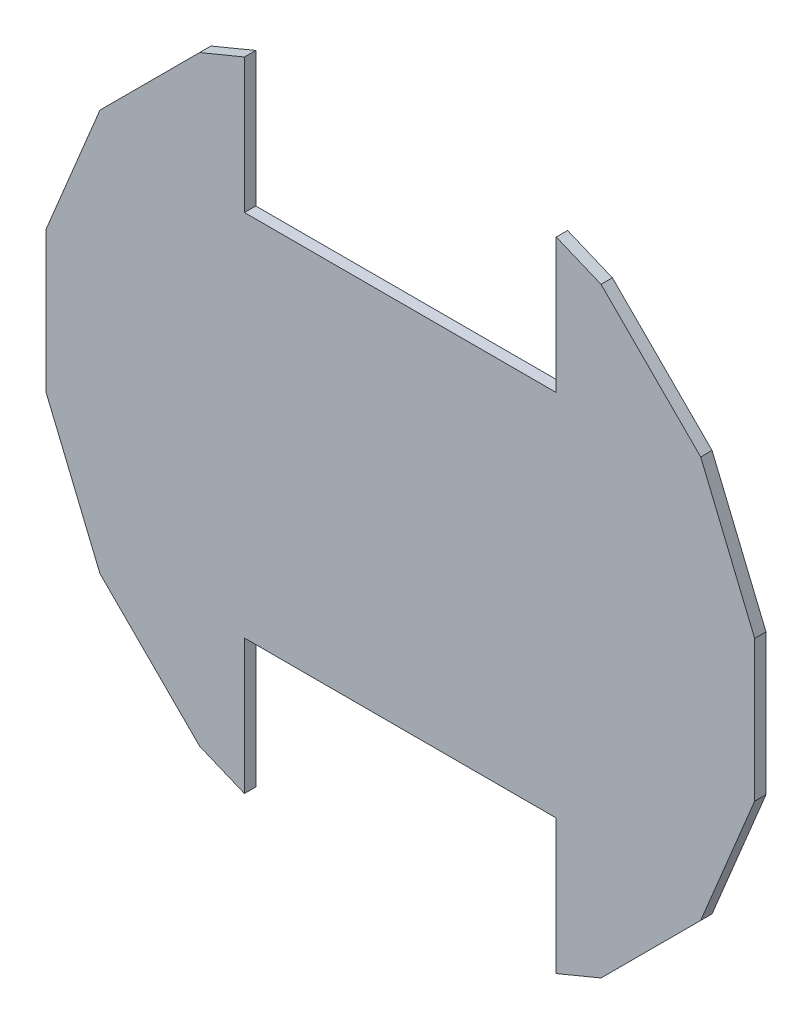
ISO-10303-21;
HEADER;
FILE_DESCRIPTION(('STEP AP214'),'2;1');
FILE_NAME('part.step','',(''),(''),'','','');
FILE_SCHEMA(('AUTOMOTIVE_DESIGN { 1 0 10303 214 1 1 1 1 }'));
ENDSEC;
DATA;
#1=APPLICATION_CONTEXT('core data for automotive mechanical design processes');
#2=APPLICATION_PROTOCOL_DEFINITION('international standard','automotive_design',2000,#1);
#3=PRODUCT_CONTEXT('',#1,'mechanical');
#4=PRODUCT('Part','Part','',(#3));
#5=PRODUCT_RELATED_PRODUCT_CATEGORY('part','',(#4));
#6=PRODUCT_DEFINITION_FORMATION('','',#4);
#7=PRODUCT_DEFINITION_CONTEXT('part definition',#1,'design');
#8=PRODUCT_DEFINITION('design','',#6,#7);
#9=PRODUCT_DEFINITION_SHAPE('','',#8);
#10=(LENGTH_UNIT() NAMED_UNIT(*) SI_UNIT(.MILLI.,.METRE.));
#11=(NAMED_UNIT(*) PLANE_ANGLE_UNIT() SI_UNIT($,.RADIAN.));
#12=(NAMED_UNIT(*) SI_UNIT($,.STERADIAN.) SOLID_ANGLE_UNIT());
#13=UNCERTAINTY_MEASURE_WITH_UNIT(LENGTH_MEASURE(1.E-05),#10,'distance_accuracy_value','');
#14=(GEOMETRIC_REPRESENTATION_CONTEXT(3) GLOBAL_UNCERTAINTY_ASSIGNED_CONTEXT((#13)) GLOBAL_UNIT_ASSIGNED_CONTEXT((#10,
#11,#12)) REPRESENTATION_CONTEXT('',''));
#15=CARTESIAN_POINT('',(0.,0.,0.));
#16=DIRECTION('',(0.,0.,1.));
#17=DIRECTION('',(1.,0.,0.));
#18=AXIS2_PLACEMENT_3D('',#15,#16,#17);
#19=CARTESIAN_POINT('',(0.,26.,1.6));
#20=DIRECTION('',(0.,1.,0.));
#21=DIRECTION('',(0.,0.,1.));
#22=AXIS2_PLACEMENT_3D('',#19,#20,#21);
#23=PLANE('',#22);
#24=DIRECTION('',(1.,0.,0.));
#25=VECTOR('',#24,1.);
#26=CARTESIAN_POINT('',(0.,26.,0.));
#27=LINE('',#26,#25);
#28=CARTESIAN_POINT('',(-22.,26.,0.));
#29=VERTEX_POINT('',#28);
#30=CARTESIAN_POINT('',(22.,26.,0.));
#31=VERTEX_POINT('',#30);
#32=EDGE_CURVE('E203',#29,#31,#27,.T.);
#33=ORIENTED_EDGE('',*,*,#32,.F.);
#34=DIRECTION('',(0.,0.,-1.));
#35=VECTOR('',#34,1.);
#36=CARTESIAN_POINT('',(-22.,26.,1.6));
#37=LINE('',#36,#35);
#38=CARTESIAN_POINT('',(-22.,26.,1.6));
#39=VERTEX_POINT('',#38);
#40=EDGE_CURVE('E11',#39,#29,#37,.T.);
#41=ORIENTED_EDGE('',*,*,#40,.F.);
#42=DIRECTION('',(1.,0.,0.));
#43=VECTOR('',#42,1.);
#44=CARTESIAN_POINT('',(0.,26.,1.6));
#45=LINE('',#44,#43);
#46=CARTESIAN_POINT('',(22.,26.,1.6));
#47=VERTEX_POINT('',#46);
#48=EDGE_CURVE('E245',#39,#47,#45,.T.);
#49=ORIENTED_EDGE('',*,*,#48,.T.);
#50=DIRECTION('',(0.,0.,-1.));
#51=VECTOR('',#50,1.);
#52=CARTESIAN_POINT('',(22.,26.,1.6));
#53=LINE('',#52,#51);
#54=EDGE_CURVE('E53',#47,#31,#53,.T.);
#55=ORIENTED_EDGE('',*,*,#54,.T.);
#56=EDGE_LOOP('',(#33,#41,#49,#55));
#57=FACE_BOUND('',#56,.T.);
#58=ADVANCED_FACE('F37',(#57),#23,.T.);
#59=CARTESIAN_POINT('',(-22.,0.,1.6));
#60=DIRECTION('',(-1.,0.,0.));
#61=DIRECTION('',(0.,-1.,0.));
#62=AXIS2_PLACEMENT_3D('',#59,#60,#61);
#63=PLANE('',#62);
#64=DIRECTION('',(0.,1.,0.));
#65=VECTOR('',#64,1.);
#66=CARTESIAN_POINT('',(-22.,0.,0.));
#67=LINE('',#66,#65);
#68=CARTESIAN_POINT('',(-22.,45.0069116424116,0.));
#69=VERTEX_POINT('',#68);
#70=EDGE_CURVE('E205',#29,#69,#67,.T.);
#71=ORIENTED_EDGE('',*,*,#70,.T.);
#72=DIRECTION('',(0.,0.,-1.));
#73=VECTOR('',#72,1.);
#74=CARTESIAN_POINT('',(-22.,45.0069116424116,1.6));
#75=LINE('',#74,#73);
#76=CARTESIAN_POINT('',(-22.,45.0069116424116,1.6));
#77=VERTEX_POINT('',#76);
#78=EDGE_CURVE('E45',#77,#69,#75,.T.);
#79=ORIENTED_EDGE('',*,*,#78,.F.);
#80=DIRECTION('',(0.,1.,0.));
#81=VECTOR('',#80,1.);
#82=CARTESIAN_POINT('',(-22.,0.,1.6));
#83=LINE('',#82,#81);
#84=EDGE_CURVE('E571',#39,#77,#83,.T.);
#85=ORIENTED_EDGE('',*,*,#84,.F.);
#86=ORIENTED_EDGE('',*,*,#40,.T.);
#87=EDGE_LOOP('',(#71,#79,#85,#86));
#88=FACE_BOUND('',#87,.T.);
#89=ADVANCED_FACE('F361',(#88),#63,.F.);
#90=CARTESIAN_POINT('',(-19.1341716182545,46.1939766255643,1.6));
#91=DIRECTION('',(0.38268343236509,-0.923879532511287,0.));
#92=DIRECTION('',(0.923879532511287,0.38268343236509,0.));
#93=AXIS2_PLACEMENT_3D('',#90,#91,#92);
#94=PLANE('',#93);
#95=DIRECTION('',(-0.923879532511287,-0.38268343236509,0.));
#96=VECTOR('',#95,1.);
#97=CARTESIAN_POINT('',(-19.1341716182545,46.1939766255643,0.));
#98=LINE('',#97,#96);
#99=CARTESIAN_POINT('',(-28.3227248675261,42.3879532511287,0.));
#100=VERTEX_POINT('',#99);
#101=EDGE_CURVE('E207',#69,#100,#98,.T.);
#102=ORIENTED_EDGE('',*,*,#101,.T.);
#103=DIRECTION('',(0.,0.,-1.));
#104=VECTOR('',#103,1.);
#105=CARTESIAN_POINT('',(-28.3227248675261,42.3879532511287,1.6));
#106=LINE('',#105,#104);
#107=CARTESIAN_POINT('',(-28.3227248675261,42.3879532511287,1.6));
#108=VERTEX_POINT('',#107);
#109=EDGE_CURVE('E286',#108,#100,#106,.T.);
#110=ORIENTED_EDGE('',*,*,#109,.F.);
#111=DIRECTION('',(-0.923879532511287,-0.38268343236509,0.));
#112=VECTOR('',#111,1.);
#113=CARTESIAN_POINT('',(-19.1341716182545,46.1939766255643,1.6));
#114=LINE('',#113,#112);
#115=EDGE_CURVE('E295',#77,#108,#114,.T.);
#116=ORIENTED_EDGE('',*,*,#115,.F.);
#117=ORIENTED_EDGE('',*,*,#78,.T.);
#118=EDGE_LOOP('',(#102,#110,#116,#117));
#119=FACE_BOUND('',#118,.T.);
#120=ADVANCED_FACE('F293',(#119),#94,.F.);
#121=CARTESIAN_POINT('',(-35.3553390593274,35.3553390593274,1.6));
#122=DIRECTION('',(0.707106781186548,-0.707106781186548,0.));
#123=DIRECTION('',(0.707106781186548,0.707106781186548,0.));
#124=AXIS2_PLACEMENT_3D('',#121,#122,#123);
#125=PLANE('',#124);
#126=DIRECTION('',(-0.707106781186548,-0.707106781186548,0.));
#127=VECTOR('',#126,1.);
#128=CARTESIAN_POINT('',(-35.3553390593274,35.3553390593274,0.));
#129=LINE('',#128,#127);
#130=CARTESIAN_POINT('',(-42.3879532511287,28.3227248675261,0.));
#131=VERTEX_POINT('',#130);
#132=EDGE_CURVE('E209',#100,#131,#129,.T.);
#133=ORIENTED_EDGE('',*,*,#132,.T.);
#134=DIRECTION('',(0.,0.,-1.));
#135=VECTOR('',#134,1.);
#136=CARTESIAN_POINT('',(-42.3879532511287,28.3227248675261,1.6));
#137=LINE('',#136,#135);
#138=CARTESIAN_POINT('',(-42.3879532511287,28.3227248675261,1.6));
#139=VERTEX_POINT('',#138);
#140=EDGE_CURVE('E283',#139,#131,#137,.T.);
#141=ORIENTED_EDGE('',*,*,#140,.F.);
#142=DIRECTION('',(-0.707106781186548,-0.707106781186548,0.));
#143=VECTOR('',#142,1.);
#144=CARTESIAN_POINT('',(-35.3553390593274,35.3553390593274,1.6));
#145=LINE('',#144,#143);
#146=EDGE_CURVE('E314',#108,#139,#145,.T.);
#147=ORIENTED_EDGE('',*,*,#146,.F.);
#148=ORIENTED_EDGE('',*,*,#109,.T.);
#149=EDGE_LOOP('',(#133,#141,#147,#148));
#150=FACE_BOUND('',#149,.T.);
#151=ADVANCED_FACE('F305',(#150),#125,.F.);
#152=CARTESIAN_POINT('',(-46.1939766255643,19.1341716182545,1.6));
#153=DIRECTION('',(0.923879532511287,-0.38268343236509,0.));
#154=DIRECTION('',(0.38268343236509,0.923879532511287,0.));
#155=AXIS2_PLACEMENT_3D('',#152,#153,#154);
#156=PLANE('',#155);
#157=DIRECTION('',(-0.38268343236509,-0.923879532511287,0.));
#158=VECTOR('',#157,1.);
#159=CARTESIAN_POINT('',(-46.1939766255643,19.1341716182545,0.));
#160=LINE('',#159,#158);
#161=CARTESIAN_POINT('',(-50.,9.9456183689829,0.));
#162=VERTEX_POINT('',#161);
#163=EDGE_CURVE('E211',#131,#162,#160,.T.);
#164=ORIENTED_EDGE('',*,*,#163,.T.);
#165=DIRECTION('',(0.,0.,-1.));
#166=VECTOR('',#165,1.);
#167=CARTESIAN_POINT('',(-50.,9.9456183689829,1.6));
#168=LINE('',#167,#166);
#169=CARTESIAN_POINT('',(-50.,9.9456183689829,1.6));
#170=VERTEX_POINT('',#169);
#171=EDGE_CURVE('E280',#170,#162,#168,.T.);
#172=ORIENTED_EDGE('',*,*,#171,.F.);
#173=DIRECTION('',(-0.38268343236509,-0.923879532511287,0.));
#174=VECTOR('',#173,1.);
#175=CARTESIAN_POINT('',(-46.1939766255643,19.1341716182545,1.6));
#176=LINE('',#175,#174);
#177=EDGE_CURVE('E311',#139,#170,#176,.T.);
#178=ORIENTED_EDGE('',*,*,#177,.F.);
#179=ORIENTED_EDGE('',*,*,#140,.T.);
#180=EDGE_LOOP('',(#164,#172,#178,#179));
#181=FACE_BOUND('',#180,.T.);
#182=ADVANCED_FACE('F309',(#181),#156,.F.);
#183=CARTESIAN_POINT('',(-50.,0.,1.6));
#184=DIRECTION('',(1.,0.,0.));
#185=DIRECTION('',(0.,0.,-1.));
#186=AXIS2_PLACEMENT_3D('',#183,#184,#185);
#187=PLANE('',#186);
#188=DIRECTION('',(0.,-1.,0.));
#189=VECTOR('',#188,1.);
#190=CARTESIAN_POINT('',(-50.,0.,0.));
#191=LINE('',#190,#189);
#192=CARTESIAN_POINT('',(-50.,-9.94561836898291,0.));
#193=VERTEX_POINT('',#192);
#194=EDGE_CURVE('E213',#162,#193,#191,.T.);
#195=ORIENTED_EDGE('',*,*,#194,.T.);
#196=DIRECTION('',(0.,0.,-1.));
#197=VECTOR('',#196,1.);
#198=CARTESIAN_POINT('',(-50.,-9.94561836898291,1.6));
#199=LINE('',#198,#197);
#200=CARTESIAN_POINT('',(-50.,-9.94561836898291,1.6));
#201=VERTEX_POINT('',#200);
#202=EDGE_CURVE('E277',#201,#193,#199,.T.);
#203=ORIENTED_EDGE('',*,*,#202,.F.);
#204=DIRECTION('',(0.,-1.,0.));
#205=VECTOR('',#204,1.);
#206=CARTESIAN_POINT('',(-50.,0.,1.6));
#207=LINE('',#206,#205);
#208=EDGE_CURVE('E313',#170,#201,#207,.T.);
#209=ORIENTED_EDGE('',*,*,#208,.F.);
#210=ORIENTED_EDGE('',*,*,#171,.T.);
#211=EDGE_LOOP('',(#195,#203,#209,#210));
#212=FACE_BOUND('',#211,.T.);
#213=ADVANCED_FACE('F374',(#212),#187,.F.);
#214=CARTESIAN_POINT('',(-46.1939766255643,-19.1341716182545,1.6));
#215=DIRECTION('',(0.923879532511287,0.38268343236509,0.));
#216=DIRECTION('',(-0.38268343236509,0.923879532511287,0.));
#217=AXIS2_PLACEMENT_3D('',#214,#215,#216);
#218=PLANE('',#217);
#219=DIRECTION('',(0.38268343236509,-0.923879532511287,0.));
#220=VECTOR('',#219,1.);
#221=CARTESIAN_POINT('',(-46.1939766255643,-19.1341716182545,0.));
#222=LINE('',#221,#220);
#223=CARTESIAN_POINT('',(-42.3879532511287,-28.3227248675261,0.));
#224=VERTEX_POINT('',#223);
#225=EDGE_CURVE('E215',#193,#224,#222,.T.);
#226=ORIENTED_EDGE('',*,*,#225,.T.);
#227=DIRECTION('',(0.,0.,-1.));
#228=VECTOR('',#227,1.);
#229=CARTESIAN_POINT('',(-42.3879532511287,-28.3227248675261,1.6));
#230=LINE('',#229,#228);
#231=CARTESIAN_POINT('',(-42.3879532511287,-28.3227248675261,1.6));
#232=VERTEX_POINT('',#231);
#233=EDGE_CURVE('E274',#232,#224,#230,.T.);
#234=ORIENTED_EDGE('',*,*,#233,.F.);
#235=DIRECTION('',(0.38268343236509,-0.923879532511287,0.));
#236=VECTOR('',#235,1.);
#237=CARTESIAN_POINT('',(-46.1939766255643,-19.1341716182545,1.6));
#238=LINE('',#237,#236);
#239=EDGE_CURVE('E316',#201,#232,#238,.T.);
#240=ORIENTED_EDGE('',*,*,#239,.F.);
#241=ORIENTED_EDGE('',*,*,#202,.T.);
#242=EDGE_LOOP('',(#226,#234,#240,#241));
#243=FACE_BOUND('',#242,.T.);
#244=ADVANCED_FACE('F377',(#243),#218,.F.);
#245=CARTESIAN_POINT('',(-35.3553390593274,-35.3553390593274,1.6));
#246=DIRECTION('',(0.707106781186548,0.707106781186548,0.));
#247=DIRECTION('',(-0.707106781186548,0.707106781186548,0.));
#248=AXIS2_PLACEMENT_3D('',#245,#246,#247);
#249=PLANE('',#248);
#250=DIRECTION('',(0.707106781186548,-0.707106781186548,0.));
#251=VECTOR('',#250,1.);
#252=CARTESIAN_POINT('',(-35.3553390593274,-35.3553390593274,0.));
#253=LINE('',#252,#251);
#254=CARTESIAN_POINT('',(-28.3227248675261,-42.3879532511286,0.));
#255=VERTEX_POINT('',#254);
#256=EDGE_CURVE('E217',#224,#255,#253,.T.);
#257=ORIENTED_EDGE('',*,*,#256,.T.);
#258=DIRECTION('',(0.,0.,-1.));
#259=VECTOR('',#258,1.);
#260=CARTESIAN_POINT('',(-28.3227248675261,-42.3879532511286,1.6));
#261=LINE('',#260,#259);
#262=CARTESIAN_POINT('',(-28.3227248675261,-42.3879532511286,1.6));
#263=VERTEX_POINT('',#262);
#264=EDGE_CURVE('E271',#263,#255,#261,.T.);
#265=ORIENTED_EDGE('',*,*,#264,.F.);
#266=DIRECTION('',(0.707106781186548,-0.707106781186548,0.));
#267=VECTOR('',#266,1.);
#268=CARTESIAN_POINT('',(-35.3553390593274,-35.3553390593274,1.6));
#269=LINE('',#268,#267);
#270=EDGE_CURVE('E322',#232,#263,#269,.T.);
#271=ORIENTED_EDGE('',*,*,#270,.F.);
#272=ORIENTED_EDGE('',*,*,#233,.T.);
#273=EDGE_LOOP('',(#257,#265,#271,#272));
#274=FACE_BOUND('',#273,.T.);
#275=ADVANCED_FACE('F381',(#274),#249,.F.);
#276=CARTESIAN_POINT('',(-19.1341716182545,-46.1939766255643,1.6));
#277=DIRECTION('',(0.38268343236509,0.923879532511287,0.));
#278=DIRECTION('',(-0.923879532511287,0.38268343236509,0.));
#279=AXIS2_PLACEMENT_3D('',#276,#277,#278);
#280=PLANE('',#279);
#281=DIRECTION('',(0.923879532511287,-0.38268343236509,0.));
#282=VECTOR('',#281,1.);
#283=CARTESIAN_POINT('',(-19.1341716182545,-46.1939766255643,0.));
#284=LINE('',#283,#282);
#285=CARTESIAN_POINT('',(-22.,-45.0069116424116,0.));
#286=VERTEX_POINT('',#285);
#287=EDGE_CURVE('E219',#255,#286,#284,.T.);
#288=ORIENTED_EDGE('',*,*,#287,.T.);
#289=DIRECTION('',(0.,0.,-1.));
#290=VECTOR('',#289,1.);
#291=CARTESIAN_POINT('',(-22.,-45.0069116424116,1.6));
#292=LINE('',#291,#290);
#293=CARTESIAN_POINT('',(-22.,-45.0069116424116,1.6));
#294=VERTEX_POINT('',#293);
#295=EDGE_CURVE('E269',#294,#286,#292,.T.);
#296=ORIENTED_EDGE('',*,*,#295,.F.);
#297=DIRECTION('',(0.923879532511287,-0.38268343236509,0.));
#298=VECTOR('',#297,1.);
#299=CARTESIAN_POINT('',(-19.1341716182545,-46.1939766255643,1.6));
#300=LINE('',#299,#298);
#301=EDGE_CURVE('E324',#263,#294,#300,.T.);
#302=ORIENTED_EDGE('',*,*,#301,.F.);
#303=ORIENTED_EDGE('',*,*,#264,.T.);
#304=EDGE_LOOP('',(#288,#296,#302,#303));
#305=FACE_BOUND('',#304,.T.);
#306=ADVANCED_FACE('F385',(#305),#280,.F.);
#307=CARTESIAN_POINT('',(-22.,0.,1.6));
#308=DIRECTION('',(1.,0.,0.));
#309=DIRECTION('',(0.,1.,0.));
#310=AXIS2_PLACEMENT_3D('',#307,#308,#309);
#311=PLANE('',#310);
#312=DIRECTION('',(0.,-1.,0.));
#313=VECTOR('',#312,1.);
#314=CARTESIAN_POINT('',(-22.,0.,0.));
#315=LINE('',#314,#313);
#316=CARTESIAN_POINT('',(-22.,-26.,0.));
#317=VERTEX_POINT('',#316);
#318=EDGE_CURVE('E222',#317,#286,#315,.T.);
#319=ORIENTED_EDGE('',*,*,#318,.F.);
#320=DIRECTION('',(0.,0.,-1.));
#321=VECTOR('',#320,1.);
#322=CARTESIAN_POINT('',(-22.,-26.,1.6));
#323=LINE('',#322,#321);
#324=CARTESIAN_POINT('',(-22.,-26.,1.6));
#325=VERTEX_POINT('',#324);
#326=EDGE_CURVE('E267',#325,#317,#323,.T.);
#327=ORIENTED_EDGE('',*,*,#326,.F.);
#328=DIRECTION('',(0.,-1.,0.));
#329=VECTOR('',#328,1.);
#330=CARTESIAN_POINT('',(-22.,0.,1.6));
#331=LINE('',#330,#329);
#332=EDGE_CURVE('E326',#325,#294,#331,.T.);
#333=ORIENTED_EDGE('',*,*,#332,.T.);
#334=ORIENTED_EDGE('',*,*,#295,.T.);
#335=EDGE_LOOP('',(#319,#327,#333,#334));
#336=FACE_BOUND('',#335,.T.);
#337=ADVANCED_FACE('F389',(#336),#311,.T.);
#338=CARTESIAN_POINT('',(0.,-26.,1.6));
#339=DIRECTION('',(0.,1.,0.));
#340=DIRECTION('',(0.,0.,1.));
#341=AXIS2_PLACEMENT_3D('',#338,#339,#340);
#342=PLANE('',#341);
#343=DIRECTION('',(1.,0.,0.));
#344=VECTOR('',#343,1.);
#345=CARTESIAN_POINT('',(0.,-26.,0.));
#346=LINE('',#345,#344);
#347=CARTESIAN_POINT('',(22.,-26.,0.));
#348=VERTEX_POINT('',#347);
#349=EDGE_CURVE('E225',#317,#348,#346,.T.);
#350=ORIENTED_EDGE('',*,*,#349,.T.);
#351=DIRECTION('',(0.,0.,-1.));
#352=VECTOR('',#351,1.);
#353=CARTESIAN_POINT('',(22.,-26.,1.6));
#354=LINE('',#353,#352);
#355=CARTESIAN_POINT('',(22.,-26.,1.6));
#356=VERTEX_POINT('',#355);
#357=EDGE_CURVE('E264',#356,#348,#354,.T.);
#358=ORIENTED_EDGE('',*,*,#357,.F.);
#359=DIRECTION('',(1.,0.,0.));
#360=VECTOR('',#359,1.);
#361=CARTESIAN_POINT('',(0.,-26.,1.6));
#362=LINE('',#361,#360);
#363=EDGE_CURVE('E329',#325,#356,#362,.T.);
#364=ORIENTED_EDGE('',*,*,#363,.F.);
#365=ORIENTED_EDGE('',*,*,#326,.T.);
#366=EDGE_LOOP('',(#350,#358,#364,#365));
#367=FACE_BOUND('',#366,.T.);
#368=ADVANCED_FACE('F393',(#367),#342,.F.);
#369=CARTESIAN_POINT('',(22.,0.,1.6));
#370=DIRECTION('',(1.,0.,0.));
#371=DIRECTION('',(0.,1.,0.));
#372=AXIS2_PLACEMENT_3D('',#369,#370,#371);
#373=PLANE('',#372);
#374=DIRECTION('',(0.,-1.,0.));
#375=VECTOR('',#374,1.);
#376=CARTESIAN_POINT('',(22.,0.,0.));
#377=LINE('',#376,#375);
#378=CARTESIAN_POINT('',(22.,-45.0069116424116,0.));
#379=VERTEX_POINT('',#378);
#380=EDGE_CURVE('E227',#348,#379,#377,.T.);
#381=ORIENTED_EDGE('',*,*,#380,.T.);
#382=DIRECTION('',(0.,0.,-1.));
#383=VECTOR('',#382,1.);
#384=CARTESIAN_POINT('',(22.,-45.0069116424116,1.6));
#385=LINE('',#384,#383);
#386=CARTESIAN_POINT('',(22.,-45.0069116424116,1.6));
#387=VERTEX_POINT('',#386);
#388=EDGE_CURVE('E261',#387,#379,#385,.T.);
#389=ORIENTED_EDGE('',*,*,#388,.F.);
#390=DIRECTION('',(0.,-1.,0.));
#391=VECTOR('',#390,1.);
#392=CARTESIAN_POINT('',(22.,0.,1.6));
#393=LINE('',#392,#391);
#394=EDGE_CURVE('E331',#356,#387,#393,.T.);
#395=ORIENTED_EDGE('',*,*,#394,.F.);
#396=ORIENTED_EDGE('',*,*,#357,.T.);
#397=EDGE_LOOP('',(#381,#389,#395,#396));
#398=FACE_BOUND('',#397,.T.);
#399=ADVANCED_FACE('F397',(#398),#373,.F.);
#400=CARTESIAN_POINT('',(19.1341716182545,-46.1939766255643,1.6));
#401=DIRECTION('',(-0.38268343236509,0.923879532511287,0.));
#402=DIRECTION('',(-0.923879532511287,-0.38268343236509,0.));
#403=AXIS2_PLACEMENT_3D('',#400,#401,#402);
#404=PLANE('',#403);
#405=DIRECTION('',(0.923879532511287,0.38268343236509,0.));
#406=VECTOR('',#405,1.);
#407=CARTESIAN_POINT('',(19.1341716182545,-46.1939766255643,0.));
#408=LINE('',#407,#406);
#409=CARTESIAN_POINT('',(28.3227248675261,-42.3879532511287,0.));
#410=VERTEX_POINT('',#409);
#411=EDGE_CURVE('E229',#379,#410,#408,.T.);
#412=ORIENTED_EDGE('',*,*,#411,.T.);
#413=DIRECTION('',(0.,0.,-1.));
#414=VECTOR('',#413,1.);
#415=CARTESIAN_POINT('',(28.3227248675261,-42.3879532511287,1.6));
#416=LINE('',#415,#414);
#417=CARTESIAN_POINT('',(28.3227248675261,-42.3879532511287,1.6));
#418=VERTEX_POINT('',#417);
#419=EDGE_CURVE('E258',#418,#410,#416,.T.);
#420=ORIENTED_EDGE('',*,*,#419,.F.);
#421=DIRECTION('',(0.923879532511287,0.38268343236509,0.));
#422=VECTOR('',#421,1.);
#423=CARTESIAN_POINT('',(19.1341716182545,-46.1939766255643,1.6));
#424=LINE('',#423,#422);
#425=EDGE_CURVE('E333',#387,#418,#424,.T.);
#426=ORIENTED_EDGE('',*,*,#425,.F.);
#427=ORIENTED_EDGE('',*,*,#388,.T.);
#428=EDGE_LOOP('',(#412,#420,#426,#427));
#429=FACE_BOUND('',#428,.T.);
#430=ADVANCED_FACE('F401',(#429),#404,.F.);
#431=CARTESIAN_POINT('',(35.3553390593274,-35.3553390593274,1.6));
#432=DIRECTION('',(-0.707106781186548,0.707106781186548,0.));
#433=DIRECTION('',(-0.707106781186548,-0.707106781186547,0.));
#434=AXIS2_PLACEMENT_3D('',#431,#432,#433);
#435=PLANE('',#434);
#436=DIRECTION('',(0.707106781186548,0.707106781186547,0.));
#437=VECTOR('',#436,1.);
#438=CARTESIAN_POINT('',(35.3553390593274,-35.3553390593274,0.));
#439=LINE('',#438,#437);
#440=CARTESIAN_POINT('',(42.3879532511286,-28.3227248675261,0.));
#441=VERTEX_POINT('',#440);
#442=EDGE_CURVE('E231',#410,#441,#439,.T.);
#443=ORIENTED_EDGE('',*,*,#442,.T.);
#444=DIRECTION('',(0.,0.,-1.));
#445=VECTOR('',#444,1.);
#446=CARTESIAN_POINT('',(42.3879532511286,-28.3227248675261,1.6));
#447=LINE('',#446,#445);
#448=CARTESIAN_POINT('',(42.3879532511286,-28.3227248675261,1.6));
#449=VERTEX_POINT('',#448);
#450=EDGE_CURVE('E255',#449,#441,#447,.T.);
#451=ORIENTED_EDGE('',*,*,#450,.F.);
#452=DIRECTION('',(0.707106781186548,0.707106781186547,0.));
#453=VECTOR('',#452,1.);
#454=CARTESIAN_POINT('',(35.3553390593274,-35.3553390593274,1.6));
#455=LINE('',#454,#453);
#456=EDGE_CURVE('E335',#418,#449,#455,.T.);
#457=ORIENTED_EDGE('',*,*,#456,.F.);
#458=ORIENTED_EDGE('',*,*,#419,.T.);
#459=EDGE_LOOP('',(#443,#451,#457,#458));
#460=FACE_BOUND('',#459,.T.);
#461=ADVANCED_FACE('F405',(#460),#435,.F.);
#462=CARTESIAN_POINT('',(46.1939766255643,-19.1341716182545,1.6));
#463=DIRECTION('',(-0.923879532511287,0.382683432365089,0.));
#464=DIRECTION('',(-0.382683432365089,-0.923879532511287,0.));
#465=AXIS2_PLACEMENT_3D('',#462,#463,#464);
#466=PLANE('',#465);
#467=DIRECTION('',(0.38268343236509,0.923879532511287,0.));
#468=VECTOR('',#467,1.);
#469=CARTESIAN_POINT('',(46.1939766255643,-19.1341716182545,0.));
#470=LINE('',#469,#468);
#471=CARTESIAN_POINT('',(50.,-9.9456183689829,0.));
#472=VERTEX_POINT('',#471);
#473=EDGE_CURVE('E233',#441,#472,#470,.T.);
#474=ORIENTED_EDGE('',*,*,#473,.T.);
#475=DIRECTION('',(0.,0.,-1.));
#476=VECTOR('',#475,1.);
#477=CARTESIAN_POINT('',(50.,-9.9456183689829,1.6));
#478=LINE('',#477,#476);
#479=CARTESIAN_POINT('',(50.,-9.9456183689829,1.6));
#480=VERTEX_POINT('',#479);
#481=EDGE_CURVE('E252',#480,#472,#478,.T.);
#482=ORIENTED_EDGE('',*,*,#481,.F.);
#483=DIRECTION('',(0.38268343236509,0.923879532511287,0.));
#484=VECTOR('',#483,1.);
#485=CARTESIAN_POINT('',(46.1939766255643,-19.1341716182545,1.6));
#486=LINE('',#485,#484);
#487=EDGE_CURVE('E337',#449,#480,#486,.T.);
#488=ORIENTED_EDGE('',*,*,#487,.F.);
#489=ORIENTED_EDGE('',*,*,#450,.T.);
#490=EDGE_LOOP('',(#474,#482,#488,#489));
#491=FACE_BOUND('',#490,.T.);
#492=ADVANCED_FACE('F409',(#491),#466,.F.);
#493=CARTESIAN_POINT('',(50.,0.,1.6));
#494=DIRECTION('',(-1.,0.,0.));
#495=DIRECTION('',(0.,0.,1.));
#496=AXIS2_PLACEMENT_3D('',#493,#494,#495);
#497=PLANE('',#496);
#498=DIRECTION('',(0.,1.,0.));
#499=VECTOR('',#498,1.);
#500=CARTESIAN_POINT('',(50.,0.,0.));
#501=LINE('',#500,#499);
#502=CARTESIAN_POINT('',(50.,9.94561836898291,0.));
#503=VERTEX_POINT('',#502);
#504=EDGE_CURVE('E235',#472,#503,#501,.T.);
#505=ORIENTED_EDGE('',*,*,#504,.T.);
#506=DIRECTION('',(0.,0.,-1.));
#507=VECTOR('',#506,1.);
#508=CARTESIAN_POINT('',(50.,9.94561836898291,1.6));
#509=LINE('',#508,#507);
#510=CARTESIAN_POINT('',(50.,9.94561836898291,1.6));
#511=VERTEX_POINT('',#510);
#512=EDGE_CURVE('E249',#511,#503,#509,.T.);
#513=ORIENTED_EDGE('',*,*,#512,.F.);
#514=DIRECTION('',(0.,1.,0.));
#515=VECTOR('',#514,1.);
#516=CARTESIAN_POINT('',(50.,0.,1.6));
#517=LINE('',#516,#515);
#518=EDGE_CURVE('E339',#480,#511,#517,.T.);
#519=ORIENTED_EDGE('',*,*,#518,.F.);
#520=ORIENTED_EDGE('',*,*,#481,.T.);
#521=EDGE_LOOP('',(#505,#513,#519,#520));
#522=FACE_BOUND('',#521,.T.);
#523=ADVANCED_FACE('F345',(#522),#497,.F.);
#524=CARTESIAN_POINT('',(46.1939766255643,19.1341716182545,1.6));
#525=DIRECTION('',(-0.923879532511287,-0.38268343236509,0.));
#526=DIRECTION('',(0.38268343236509,-0.923879532511287,0.));
#527=AXIS2_PLACEMENT_3D('',#524,#525,#526);
#528=PLANE('',#527);
#529=DIRECTION('',(-0.38268343236509,0.923879532511287,0.));
#530=VECTOR('',#529,1.);
#531=CARTESIAN_POINT('',(46.1939766255643,19.1341716182545,0.));
#532=LINE('',#531,#530);
#533=CARTESIAN_POINT('',(42.3879532511287,28.3227248675261,0.));
#534=VERTEX_POINT('',#533);
#535=EDGE_CURVE('E237',#503,#534,#532,.T.);
#536=ORIENTED_EDGE('',*,*,#535,.T.);
#537=DIRECTION('',(0.,0.,-1.));
#538=VECTOR('',#537,1.);
#539=CARTESIAN_POINT('',(42.3879532511287,28.3227248675261,1.6));
#540=LINE('',#539,#538);
#541=CARTESIAN_POINT('',(42.3879532511287,28.3227248675261,1.6));
#542=VERTEX_POINT('',#541);
#543=EDGE_CURVE('E195',#542,#534,#540,.T.);
#544=ORIENTED_EDGE('',*,*,#543,.F.);
#545=DIRECTION('',(-0.38268343236509,0.923879532511287,0.));
#546=VECTOR('',#545,1.);
#547=CARTESIAN_POINT('',(46.1939766255643,19.1341716182545,1.6));
#548=LINE('',#547,#546);
#549=EDGE_CURVE('E183',#511,#542,#548,.T.);
#550=ORIENTED_EDGE('',*,*,#549,.F.);
#551=ORIENTED_EDGE('',*,*,#512,.T.);
#552=EDGE_LOOP('',(#536,#544,#550,#551));
#553=FACE_BOUND('',#552,.T.);
#554=ADVANCED_FACE('F349',(#553),#528,.F.);
#555=CARTESIAN_POINT('',(35.3553390593274,35.3553390593274,1.6));
#556=DIRECTION('',(-0.707106781186548,-0.707106781186548,0.));
#557=DIRECTION('',(0.707106781186548,-0.707106781186548,0.));
#558=AXIS2_PLACEMENT_3D('',#555,#556,#557);
#559=PLANE('',#558);
#560=DIRECTION('',(-0.707106781186548,0.707106781186548,0.));
#561=VECTOR('',#560,1.);
#562=CARTESIAN_POINT('',(35.3553390593274,35.3553390593274,0.));
#563=LINE('',#562,#561);
#564=CARTESIAN_POINT('',(28.3227248675261,42.3879532511287,0.));
#565=VERTEX_POINT('',#564);
#566=EDGE_CURVE('E192',#534,#565,#563,.T.);
#567=ORIENTED_EDGE('',*,*,#566,.T.);
#568=DIRECTION('',(0.,0.,-1.));
#569=VECTOR('',#568,1.);
#570=CARTESIAN_POINT('',(28.3227248675261,42.3879532511287,1.6));
#571=LINE('',#570,#569);
#572=CARTESIAN_POINT('',(28.3227248675261,42.3879532511287,1.6));
#573=VERTEX_POINT('',#572);
#574=EDGE_CURVE('E189',#573,#565,#571,.T.);
#575=ORIENTED_EDGE('',*,*,#574,.F.);
#576=DIRECTION('',(-0.707106781186548,0.707106781186548,0.));
#577=VECTOR('',#576,1.);
#578=CARTESIAN_POINT('',(35.3553390593274,35.3553390593274,1.6));
#579=LINE('',#578,#577);
#580=EDGE_CURVE('E175',#542,#573,#579,.T.);
#581=ORIENTED_EDGE('',*,*,#580,.F.);
#582=ORIENTED_EDGE('',*,*,#543,.T.);
#583=EDGE_LOOP('',(#567,#575,#581,#582));
#584=FACE_BOUND('',#583,.T.);
#585=ADVANCED_FACE('F190',(#584),#559,.F.);
#586=CARTESIAN_POINT('',(19.1341716182545,46.1939766255643,1.6));
#587=DIRECTION('',(-0.38268343236509,-0.923879532511287,0.));
#588=DIRECTION('',(0.923879532511287,-0.38268343236509,0.));
#589=AXIS2_PLACEMENT_3D('',#586,#587,#588);
#590=PLANE('',#589);
#591=DIRECTION('',(-0.923879532511287,0.38268343236509,0.));
#592=VECTOR('',#591,1.);
#593=CARTESIAN_POINT('',(19.1341716182545,46.1939766255643,0.));
#594=LINE('',#593,#592);
#595=CARTESIAN_POINT('',(22.,45.0069116424116,0.));
#596=VERTEX_POINT('',#595);
#597=EDGE_CURVE('E240',#565,#596,#594,.T.);
#598=ORIENTED_EDGE('',*,*,#597,.T.);
#599=DIRECTION('',(0.,0.,-1.));
#600=VECTOR('',#599,1.);
#601=CARTESIAN_POINT('',(22.,45.0069116424116,1.6));
#602=LINE('',#601,#600);
#603=CARTESIAN_POINT('',(22.,45.0069116424116,1.6));
#604=VERTEX_POINT('',#603);
#605=EDGE_CURVE('E115',#604,#596,#602,.T.);
#606=ORIENTED_EDGE('',*,*,#605,.F.);
#607=DIRECTION('',(-0.923879532511287,0.38268343236509,0.));
#608=VECTOR('',#607,1.);
#609=CARTESIAN_POINT('',(19.1341716182545,46.1939766255643,1.6));
#610=LINE('',#609,#608);
#611=EDGE_CURVE('E181',#573,#604,#610,.T.);
#612=ORIENTED_EDGE('',*,*,#611,.F.);
#613=ORIENTED_EDGE('',*,*,#574,.T.);
#614=EDGE_LOOP('',(#598,#606,#612,#613));
#615=FACE_BOUND('',#614,.T.);
#616=ADVANCED_FACE('F197',(#615),#590,.F.);
#617=CARTESIAN_POINT('',(22.,0.,1.6));
#618=DIRECTION('',(-1.,0.,0.));
#619=DIRECTION('',(0.,-1.,0.));
#620=AXIS2_PLACEMENT_3D('',#617,#618,#619);
#621=PLANE('',#620);
#622=DIRECTION('',(0.,1.,0.));
#623=VECTOR('',#622,1.);
#624=CARTESIAN_POINT('',(22.,0.,0.));
#625=LINE('',#624,#623);
#626=EDGE_CURVE('E242',#31,#596,#625,.T.);
#627=ORIENTED_EDGE('',*,*,#626,.F.);
#628=ORIENTED_EDGE('',*,*,#54,.F.);
#629=DIRECTION('',(0.,1.,0.));
#630=VECTOR('',#629,1.);
#631=CARTESIAN_POINT('',(22.,0.,1.6));
#632=LINE('',#631,#630);
#633=EDGE_CURVE('E198',#47,#604,#632,.T.);
#634=ORIENTED_EDGE('',*,*,#633,.T.);
#635=ORIENTED_EDGE('',*,*,#605,.T.);
#636=EDGE_LOOP('',(#627,#628,#634,#635));
#637=FACE_BOUND('',#636,.T.);
#638=ADVANCED_FACE('F350',(#637),#621,.T.);
#639=CARTESIAN_POINT('',(0.,0.,1.6));
#640=DIRECTION('',(0.,0.,1.));
#641=DIRECTION('',(1.,0.,0.));
#642=AXIS2_PLACEMENT_3D('',#639,#640,#641);
#643=PLANE('',#642);
#644=ORIENTED_EDGE('',*,*,#48,.F.);
#645=ORIENTED_EDGE('',*,*,#84,.T.);
#646=ORIENTED_EDGE('',*,*,#115,.T.);
#647=ORIENTED_EDGE('',*,*,#146,.T.);
#648=ORIENTED_EDGE('',*,*,#177,.T.);
#649=ORIENTED_EDGE('',*,*,#208,.T.);
#650=ORIENTED_EDGE('',*,*,#239,.T.);
#651=ORIENTED_EDGE('',*,*,#270,.T.);
#652=ORIENTED_EDGE('',*,*,#301,.T.);
#653=ORIENTED_EDGE('',*,*,#332,.F.);
#654=ORIENTED_EDGE('',*,*,#363,.T.);
#655=ORIENTED_EDGE('',*,*,#394,.T.);
#656=ORIENTED_EDGE('',*,*,#425,.T.);
#657=ORIENTED_EDGE('',*,*,#456,.T.);
#658=ORIENTED_EDGE('',*,*,#487,.T.);
#659=ORIENTED_EDGE('',*,*,#518,.T.);
#660=ORIENTED_EDGE('',*,*,#549,.T.);
#661=ORIENTED_EDGE('',*,*,#580,.T.);
#662=ORIENTED_EDGE('',*,*,#611,.T.);
#663=ORIENTED_EDGE('',*,*,#633,.F.);
#664=EDGE_LOOP('',(#644,#645,#646,#647,#648,#649,#650,#651,#652,#653,#654,#655,#656,#657,#658,
#659,#660,#661,#662,#663));
#665=FACE_BOUND('',#664,.T.);
#666=ADVANCED_FACE('F178',(#665),#643,.T.);
#667=CARTESIAN_POINT('',(0.,0.,0.));
#668=DIRECTION('',(0.,0.,1.));
#669=DIRECTION('',(1.,0.,0.));
#670=AXIS2_PLACEMENT_3D('',#667,#668,#669);
#671=PLANE('',#670);
#672=ORIENTED_EDGE('',*,*,#32,.T.);
#673=ORIENTED_EDGE('',*,*,#626,.T.);
#674=ORIENTED_EDGE('',*,*,#597,.F.);
#675=ORIENTED_EDGE('',*,*,#566,.F.);
#676=ORIENTED_EDGE('',*,*,#535,.F.);
#677=ORIENTED_EDGE('',*,*,#504,.F.);
#678=ORIENTED_EDGE('',*,*,#473,.F.);
#679=ORIENTED_EDGE('',*,*,#442,.F.);
#680=ORIENTED_EDGE('',*,*,#411,.F.);
#681=ORIENTED_EDGE('',*,*,#380,.F.);
#682=ORIENTED_EDGE('',*,*,#349,.F.);
#683=ORIENTED_EDGE('',*,*,#318,.T.);
#684=ORIENTED_EDGE('',*,*,#287,.F.);
#685=ORIENTED_EDGE('',*,*,#256,.F.);
#686=ORIENTED_EDGE('',*,*,#225,.F.);
#687=ORIENTED_EDGE('',*,*,#194,.F.);
#688=ORIENTED_EDGE('',*,*,#163,.F.);
#689=ORIENTED_EDGE('',*,*,#132,.F.);
#690=ORIENTED_EDGE('',*,*,#101,.F.);
#691=ORIENTED_EDGE('',*,*,#70,.F.);
#692=EDGE_LOOP('',(#672,#673,#674,#675,#676,#677,#678,#679,#680,#681,#682,#683,#684,#685,#686,
#687,#688,#689,#690,#691));
#693=FACE_BOUND('',#692,.T.);
#694=ADVANCED_FACE('F300',(#693),#671,.F.);
#695=CLOSED_SHELL('',(#58,#89,#120,#151,#182,#213,#244,#275,#306,#337,#368,#399,#430,#461,#492,
#523,#554,#585,#616,#638,#666,#694));
#696=MANIFOLD_SOLID_BREP('B2',#695);
#697=ADVANCED_BREP_SHAPE_REPRESENTATION('',(#18,#696),#14);
#698=SHAPE_DEFINITION_REPRESENTATION(#9,#697);
ENDSEC;
END-ISO-10303-21;
